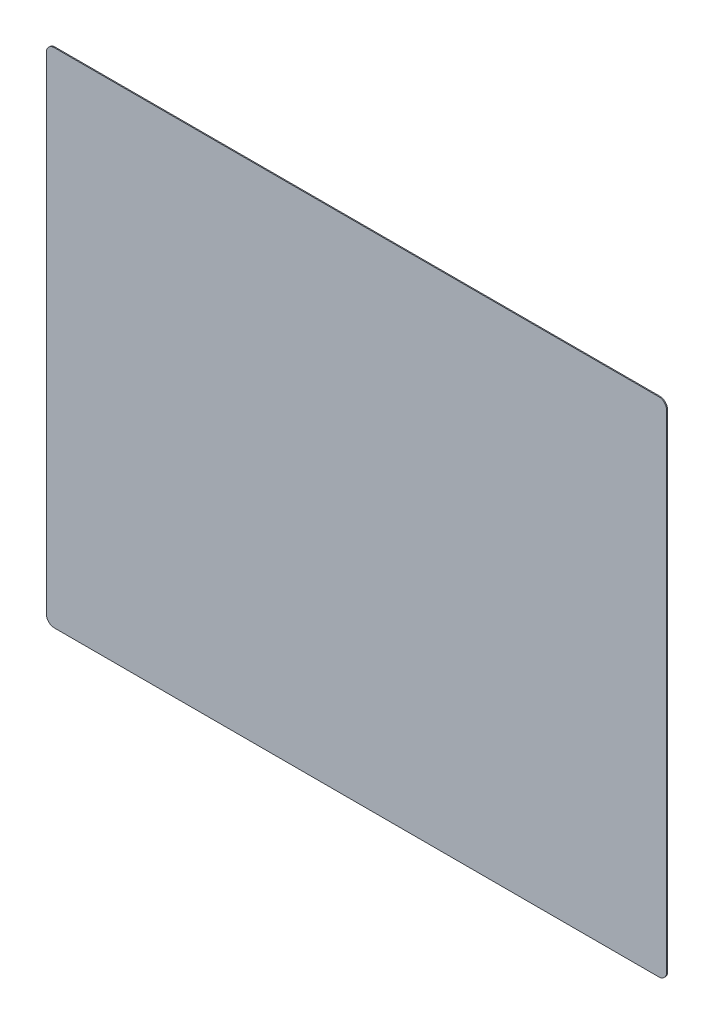
ISO-10303-21;
HEADER;
FILE_DESCRIPTION(('STEP AP214'),'2;1');
FILE_NAME('part.step','',(''),(''),'','','');
FILE_SCHEMA(('AUTOMOTIVE_DESIGN { 1 0 10303 214 1 1 1 1 }'));
ENDSEC;
DATA;
#1=APPLICATION_CONTEXT('core data for automotive mechanical design processes');
#2=APPLICATION_PROTOCOL_DEFINITION('international standard','automotive_design',2000,#1);
#3=PRODUCT_CONTEXT('',#1,'mechanical');
#4=PRODUCT('Part','Part','',(#3));
#5=PRODUCT_RELATED_PRODUCT_CATEGORY('part','',(#4));
#6=PRODUCT_DEFINITION_FORMATION('','',#4);
#7=PRODUCT_DEFINITION_CONTEXT('part definition',#1,'design');
#8=PRODUCT_DEFINITION('design','',#6,#7);
#9=PRODUCT_DEFINITION_SHAPE('','',#8);
#10=(LENGTH_UNIT() NAMED_UNIT(*) SI_UNIT(.MILLI.,.METRE.));
#11=(NAMED_UNIT(*) PLANE_ANGLE_UNIT() SI_UNIT($,.RADIAN.));
#12=(NAMED_UNIT(*) SI_UNIT($,.STERADIAN.) SOLID_ANGLE_UNIT());
#13=UNCERTAINTY_MEASURE_WITH_UNIT(LENGTH_MEASURE(1.E-05),#10,'distance_accuracy_value','');
#14=(GEOMETRIC_REPRESENTATION_CONTEXT(3) GLOBAL_UNCERTAINTY_ASSIGNED_CONTEXT((#13)) GLOBAL_UNIT_ASSIGNED_CONTEXT((#10,
#11,#12)) REPRESENTATION_CONTEXT('',''));
#15=CARTESIAN_POINT('',(0.,0.,0.));
#16=DIRECTION('',(0.,0.,1.));
#17=DIRECTION('',(1.,0.,0.));
#18=AXIS2_PLACEMENT_3D('',#15,#16,#17);
#19=CARTESIAN_POINT('',(501.65,406.4,1.5875));
#20=DIRECTION('',(-1.,0.,0.));
#21=DIRECTION('',(0.,-1.,0.));
#22=AXIS2_PLACEMENT_3D('',#19,#20,#21);
#23=PLANE('',#22);
#24=DIRECTION('',(0.,1.,0.));
#25=VECTOR('',#24,1.);
#26=CARTESIAN_POINT('',(501.65,406.4,1.5875));
#27=LINE('',#26,#25);
#28=CARTESIAN_POINT('',(501.65,-393.7,1.5875));
#29=VERTEX_POINT('',#28);
#30=CARTESIAN_POINT('',(501.65,393.7,1.5875));
#31=VERTEX_POINT('',#30);
#32=EDGE_CURVE('E124',#29,#31,#27,.T.);
#33=ORIENTED_EDGE('',*,*,#32,.F.);
#34=DIRECTION('',(0.,0.,-1.));
#35=VECTOR('',#34,1.);
#36=CARTESIAN_POINT('',(501.65,-393.7,1.5875));
#37=LINE('',#36,#35);
#38=CARTESIAN_POINT('',(501.65,-393.7,0.));
#39=VERTEX_POINT('',#38);
#40=EDGE_CURVE('E108',#29,#39,#37,.T.);
#41=ORIENTED_EDGE('',*,*,#40,.T.);
#42=DIRECTION('',(0.,1.,0.));
#43=VECTOR('',#42,1.);
#44=CARTESIAN_POINT('',(501.65,406.4,0.));
#45=LINE('',#44,#43);
#46=CARTESIAN_POINT('',(501.65,393.7,0.));
#47=VERTEX_POINT('',#46);
#48=EDGE_CURVE('E121',#39,#47,#45,.T.);
#49=ORIENTED_EDGE('',*,*,#48,.T.);
#50=DIRECTION('',(0.,0.,-1.));
#51=VECTOR('',#50,1.);
#52=CARTESIAN_POINT('',(501.65,393.7,1.5875));
#53=LINE('',#52,#51);
#54=EDGE_CURVE('E127',#47,#31,#53,.F.);
#55=ORIENTED_EDGE('',*,*,#54,.T.);
#56=EDGE_LOOP('',(#33,#41,#49,#55));
#57=FACE_BOUND('',#56,.T.);
#58=ADVANCED_FACE('F38',(#57),#23,.F.);
#59=CARTESIAN_POINT('',(-501.65,406.4,1.5875));
#60=DIRECTION('',(0.,-1.,0.));
#61=DIRECTION('',(0.,0.,-1.));
#62=AXIS2_PLACEMENT_3D('',#59,#60,#61);
#63=PLANE('',#62);
#64=DIRECTION('',(-1.,0.,0.));
#65=VECTOR('',#64,1.);
#66=CARTESIAN_POINT('',(-501.65,406.4,1.5875));
#67=LINE('',#66,#65);
#68=CARTESIAN_POINT('',(488.95,406.4,1.5875));
#69=VERTEX_POINT('',#68);
#70=CARTESIAN_POINT('',(-488.95,406.4,1.5875));
#71=VERTEX_POINT('',#70);
#72=EDGE_CURVE('E198',#69,#71,#67,.T.);
#73=ORIENTED_EDGE('',*,*,#72,.F.);
#74=DIRECTION('',(0.,0.,-1.));
#75=VECTOR('',#74,1.);
#76=CARTESIAN_POINT('',(488.95,406.4,1.5875));
#77=LINE('',#76,#75);
#78=CARTESIAN_POINT('',(488.95,406.4,0.));
#79=VERTEX_POINT('',#78);
#80=EDGE_CURVE('E176',#69,#79,#77,.T.);
#81=ORIENTED_EDGE('',*,*,#80,.T.);
#82=DIRECTION('',(-1.,0.,0.));
#83=VECTOR('',#82,1.);
#84=CARTESIAN_POINT('',(-501.65,406.4,0.));
#85=LINE('',#84,#83);
#86=CARTESIAN_POINT('',(-488.95,406.4,0.));
#87=VERTEX_POINT('',#86);
#88=EDGE_CURVE('E132',#79,#87,#85,.T.);
#89=ORIENTED_EDGE('',*,*,#88,.T.);
#90=DIRECTION('',(0.,0.,-1.));
#91=VECTOR('',#90,1.);
#92=CARTESIAN_POINT('',(-488.95,406.4,1.5875));
#93=LINE('',#92,#91);
#94=EDGE_CURVE('E173',#87,#71,#93,.F.);
#95=ORIENTED_EDGE('',*,*,#94,.T.);
#96=EDGE_LOOP('',(#73,#81,#89,#95));
#97=FACE_BOUND('',#96,.T.);
#98=ADVANCED_FACE('F212',(#97),#63,.F.);
#99=CARTESIAN_POINT('',(-501.65,406.4,1.5875));
#100=DIRECTION('',(1.,0.,0.));
#101=DIRECTION('',(0.,1.,0.));
#102=AXIS2_PLACEMENT_3D('',#99,#100,#101);
#103=PLANE('',#102);
#104=DIRECTION('',(0.,-1.,0.));
#105=VECTOR('',#104,1.);
#106=CARTESIAN_POINT('',(-501.65,406.4,0.));
#107=LINE('',#106,#105);
#108=CARTESIAN_POINT('',(-501.65,393.7,0.));
#109=VERTEX_POINT('',#108);
#110=CARTESIAN_POINT('',(-501.65,-393.7,0.));
#111=VERTEX_POINT('',#110);
#112=EDGE_CURVE('E137',#109,#111,#107,.T.);
#113=ORIENTED_EDGE('',*,*,#112,.T.);
#114=DIRECTION('',(0.,0.,-1.));
#115=VECTOR('',#114,1.);
#116=CARTESIAN_POINT('',(-501.65,-393.7,1.5875));
#117=LINE('',#116,#115);
#118=CARTESIAN_POINT('',(-501.65,-393.7,1.5875));
#119=VERTEX_POINT('',#118);
#120=EDGE_CURVE('E11',#111,#119,#117,.F.);
#121=ORIENTED_EDGE('',*,*,#120,.T.);
#122=DIRECTION('',(0.,-1.,0.));
#123=VECTOR('',#122,1.);
#124=CARTESIAN_POINT('',(-501.65,406.4,1.5875));
#125=LINE('',#124,#123);
#126=CARTESIAN_POINT('',(-501.65,393.7,1.5875));
#127=VERTEX_POINT('',#126);
#128=EDGE_CURVE('E185',#127,#119,#125,.T.);
#129=ORIENTED_EDGE('',*,*,#128,.F.);
#130=DIRECTION('',(0.,0.,-1.));
#131=VECTOR('',#130,1.);
#132=CARTESIAN_POINT('',(-501.65,393.7,1.5875));
#133=LINE('',#132,#131);
#134=EDGE_CURVE('E47',#127,#109,#133,.T.);
#135=ORIENTED_EDGE('',*,*,#134,.T.);
#136=EDGE_LOOP('',(#113,#121,#129,#135));
#137=FACE_BOUND('',#136,.T.);
#138=ADVANCED_FACE('F184',(#137),#103,.F.);
#139=CARTESIAN_POINT('',(-501.65,-406.4,1.5875));
#140=DIRECTION('',(0.,1.,0.));
#141=DIRECTION('',(0.,0.,1.));
#142=AXIS2_PLACEMENT_3D('',#139,#140,#141);
#143=PLANE('',#142);
#144=DIRECTION('',(1.,0.,0.));
#145=VECTOR('',#144,1.);
#146=CARTESIAN_POINT('',(-501.65,-406.4,0.));
#147=LINE('',#146,#145);
#148=CARTESIAN_POINT('',(-488.95,-406.4,0.));
#149=VERTEX_POINT('',#148);
#150=CARTESIAN_POINT('',(488.95,-406.4,0.));
#151=VERTEX_POINT('',#150);
#152=EDGE_CURVE('E145',#149,#151,#147,.T.);
#153=ORIENTED_EDGE('',*,*,#152,.T.);
#154=DIRECTION('',(0.,0.,-1.));
#155=VECTOR('',#154,1.);
#156=CARTESIAN_POINT('',(488.95,-406.4,1.5875));
#157=LINE('',#156,#155);
#158=CARTESIAN_POINT('',(488.95,-406.4,1.5875));
#159=VERTEX_POINT('',#158);
#160=EDGE_CURVE('E109',#151,#159,#157,.F.);
#161=ORIENTED_EDGE('',*,*,#160,.T.);
#162=DIRECTION('',(1.,0.,0.));
#163=VECTOR('',#162,1.);
#164=CARTESIAN_POINT('',(-501.65,-406.4,1.5875));
#165=LINE('',#164,#163);
#166=CARTESIAN_POINT('',(-488.95,-406.4,1.5875));
#167=VERTEX_POINT('',#166);
#168=EDGE_CURVE('E140',#167,#159,#165,.T.);
#169=ORIENTED_EDGE('',*,*,#168,.F.);
#170=DIRECTION('',(0.,0.,-1.));
#171=VECTOR('',#170,1.);
#172=CARTESIAN_POINT('',(-488.95,-406.4,1.5875));
#173=LINE('',#172,#171);
#174=EDGE_CURVE('E115',#167,#149,#173,.T.);
#175=ORIENTED_EDGE('',*,*,#174,.T.);
#176=EDGE_LOOP('',(#153,#161,#169,#175));
#177=FACE_BOUND('',#176,.T.);
#178=ADVANCED_FACE('F193',(#177),#143,.F.);
#179=CARTESIAN_POINT('',(0.,0.,1.5875));
#180=DIRECTION('',(0.,0.,1.));
#181=DIRECTION('',(1.,0.,0.));
#182=AXIS2_PLACEMENT_3D('',#179,#180,#181);
#183=PLANE('',#182);
#184=ORIENTED_EDGE('',*,*,#168,.T.);
#185=CARTESIAN_POINT('',(488.95,-393.7,1.5875));
#186=DIRECTION('',(0.,0.,1.));
#187=DIRECTION('',(1.,0.,0.));
#188=AXIS2_PLACEMENT_3D('',#185,#186,#187);
#189=CIRCLE('',#188,12.7);
#190=EDGE_CURVE('E170',#159,#29,#189,.T.);
#191=ORIENTED_EDGE('',*,*,#190,.T.);
#192=ORIENTED_EDGE('',*,*,#32,.T.);
#193=CARTESIAN_POINT('',(488.95,393.7,1.5875));
#194=DIRECTION('',(0.,0.,1.));
#195=DIRECTION('',(1.,0.,0.));
#196=AXIS2_PLACEMENT_3D('',#193,#194,#195);
#197=CIRCLE('',#196,12.7);
#198=EDGE_CURVE('E167',#31,#69,#197,.T.);
#199=ORIENTED_EDGE('',*,*,#198,.T.);
#200=ORIENTED_EDGE('',*,*,#72,.T.);
#201=CARTESIAN_POINT('',(-488.95,393.7,1.5875));
#202=DIRECTION('',(0.,0.,1.));
#203=DIRECTION('',(1.,0.,0.));
#204=AXIS2_PLACEMENT_3D('',#201,#202,#203);
#205=CIRCLE('',#204,12.7);
#206=EDGE_CURVE('E59',#71,#127,#205,.T.);
#207=ORIENTED_EDGE('',*,*,#206,.T.);
#208=ORIENTED_EDGE('',*,*,#128,.T.);
#209=CARTESIAN_POINT('',(-488.95,-393.7,1.5875));
#210=DIRECTION('',(0.,0.,1.));
#211=DIRECTION('',(1.,0.,0.));
#212=AXIS2_PLACEMENT_3D('',#209,#210,#211);
#213=CIRCLE('',#212,12.7);
#214=EDGE_CURVE('E164',#119,#167,#213,.T.);
#215=ORIENTED_EDGE('',*,*,#214,.T.);
#216=EDGE_LOOP('',(#184,#191,#192,#199,#200,#207,#208,#215));
#217=FACE_BOUND('',#216,.T.);
#218=ADVANCED_FACE('F206',(#217),#183,.T.);
#219=CARTESIAN_POINT('',(0.,0.,0.));
#220=DIRECTION('',(0.,0.,1.));
#221=DIRECTION('',(1.,0.,0.));
#222=AXIS2_PLACEMENT_3D('',#219,#220,#221);
#223=PLANE('',#222);
#224=ORIENTED_EDGE('',*,*,#48,.F.);
#225=CARTESIAN_POINT('',(488.95,-393.7,0.));
#226=DIRECTION('',(0.,0.,1.));
#227=DIRECTION('',(1.,0.,0.));
#228=AXIS2_PLACEMENT_3D('',#225,#226,#227);
#229=CIRCLE('',#228,12.7);
#230=EDGE_CURVE('E104',#39,#151,#229,.F.);
#231=ORIENTED_EDGE('',*,*,#230,.T.);
#232=ORIENTED_EDGE('',*,*,#152,.F.);
#233=CARTESIAN_POINT('',(-488.95,-393.7,0.));
#234=DIRECTION('',(0.,0.,1.));
#235=DIRECTION('',(1.,0.,0.));
#236=AXIS2_PLACEMENT_3D('',#233,#234,#235);
#237=CIRCLE('',#236,12.7);
#238=EDGE_CURVE('E152',#149,#111,#237,.F.);
#239=ORIENTED_EDGE('',*,*,#238,.T.);
#240=ORIENTED_EDGE('',*,*,#112,.F.);
#241=CARTESIAN_POINT('',(-488.95,393.7,0.));
#242=DIRECTION('',(0.,0.,1.));
#243=DIRECTION('',(1.,0.,0.));
#244=AXIS2_PLACEMENT_3D('',#241,#242,#243);
#245=CIRCLE('',#244,12.7);
#246=EDGE_CURVE('E126',#109,#87,#245,.F.);
#247=ORIENTED_EDGE('',*,*,#246,.T.);
#248=ORIENTED_EDGE('',*,*,#88,.F.);
#249=CARTESIAN_POINT('',(488.95,393.7,0.));
#250=DIRECTION('',(0.,0.,1.));
#251=DIRECTION('',(1.,0.,0.));
#252=AXIS2_PLACEMENT_3D('',#249,#250,#251);
#253=CIRCLE('',#252,12.7);
#254=EDGE_CURVE('E116',#79,#47,#253,.F.);
#255=ORIENTED_EDGE('',*,*,#254,.T.);
#256=EDGE_LOOP('',(#224,#231,#232,#239,#240,#247,#248,#255));
#257=FACE_BOUND('',#256,.T.);
#258=ADVANCED_FACE('F129',(#257),#223,.F.);
#259=CARTESIAN_POINT('',(488.95,-393.7,1.5875));
#260=DIRECTION('',(0.,0.,-1.));
#261=DIRECTION('',(-1.,0.,0.));
#262=AXIS2_PLACEMENT_3D('',#259,#260,#261);
#263=CYLINDRICAL_SURFACE('',#262,12.7);
#264=ORIENTED_EDGE('',*,*,#190,.F.);
#265=ORIENTED_EDGE('',*,*,#160,.F.);
#266=ORIENTED_EDGE('',*,*,#230,.F.);
#267=ORIENTED_EDGE('',*,*,#40,.F.);
#268=EDGE_LOOP('',(#264,#265,#266,#267));
#269=FACE_BOUND('',#268,.T.);
#270=ADVANCED_FACE('F107',(#269),#263,.T.);
#271=CARTESIAN_POINT('',(488.95,393.7,1.5875));
#272=DIRECTION('',(0.,0.,-1.));
#273=DIRECTION('',(-1.,0.,0.));
#274=AXIS2_PLACEMENT_3D('',#271,#272,#273);
#275=CYLINDRICAL_SURFACE('',#274,12.7);
#276=ORIENTED_EDGE('',*,*,#198,.F.);
#277=ORIENTED_EDGE('',*,*,#54,.F.);
#278=ORIENTED_EDGE('',*,*,#254,.F.);
#279=ORIENTED_EDGE('',*,*,#80,.F.);
#280=EDGE_LOOP('',(#276,#277,#278,#279));
#281=FACE_BOUND('',#280,.T.);
#282=ADVANCED_FACE('F210',(#281),#275,.T.);
#283=CARTESIAN_POINT('',(-488.95,-393.7,1.5875));
#284=DIRECTION('',(0.,0.,-1.));
#285=DIRECTION('',(-1.,0.,0.));
#286=AXIS2_PLACEMENT_3D('',#283,#284,#285);
#287=CYLINDRICAL_SURFACE('',#286,12.7);
#288=ORIENTED_EDGE('',*,*,#214,.F.);
#289=ORIENTED_EDGE('',*,*,#120,.F.);
#290=ORIENTED_EDGE('',*,*,#238,.F.);
#291=ORIENTED_EDGE('',*,*,#174,.F.);
#292=EDGE_LOOP('',(#288,#289,#290,#291));
#293=FACE_BOUND('',#292,.T.);
#294=ADVANCED_FACE('F190',(#293),#287,.T.);
#295=CARTESIAN_POINT('',(-488.95,393.7,1.5875));
#296=DIRECTION('',(0.,0.,-1.));
#297=DIRECTION('',(-1.,0.,0.));
#298=AXIS2_PLACEMENT_3D('',#295,#296,#297);
#299=CYLINDRICAL_SURFACE('',#298,12.7);
#300=ORIENTED_EDGE('',*,*,#206,.F.);
#301=ORIENTED_EDGE('',*,*,#94,.F.);
#302=ORIENTED_EDGE('',*,*,#246,.F.);
#303=ORIENTED_EDGE('',*,*,#134,.F.);
#304=EDGE_LOOP('',(#300,#301,#302,#303));
#305=FACE_BOUND('',#304,.T.);
#306=ADVANCED_FACE('F40',(#305),#299,.T.);
#307=CLOSED_SHELL('',(#58,#98,#138,#178,#218,#258,#270,#282,#294,#306));
#308=MANIFOLD_SOLID_BREP('B2',#307);
#309=ADVANCED_BREP_SHAPE_REPRESENTATION('',(#18,#308),#14);
#310=SHAPE_DEFINITION_REPRESENTATION(#9,#309);
ENDSEC;
END-ISO-10303-21;
